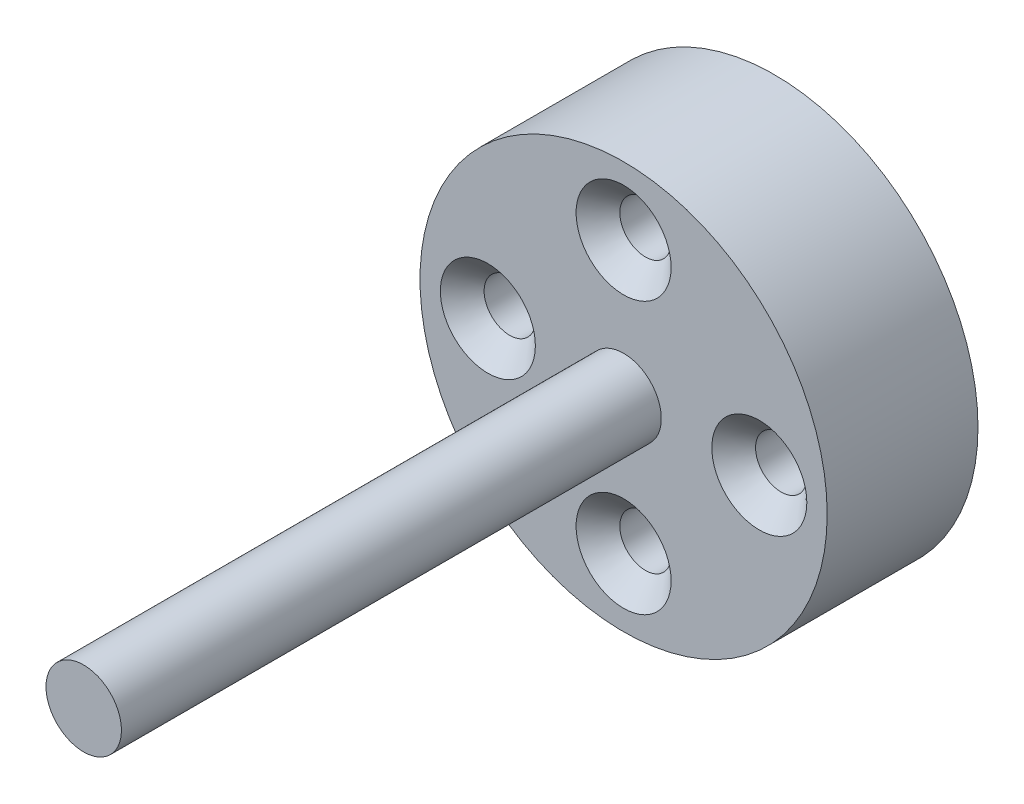
ISO-10303-21;
HEADER;
FILE_DESCRIPTION(('STEP AP214'),'2;1');
FILE_NAME('part.step','',(''),(''),'','','');
FILE_SCHEMA(('AUTOMOTIVE_DESIGN { 1 0 10303 214 1 1 1 1 }'));
ENDSEC;
DATA;
#1=APPLICATION_CONTEXT('core data for automotive mechanical design processes');
#2=APPLICATION_PROTOCOL_DEFINITION('international standard','automotive_design',2000,#1);
#3=PRODUCT_CONTEXT('',#1,'mechanical');
#4=PRODUCT('Part','Part','',(#3));
#5=PRODUCT_RELATED_PRODUCT_CATEGORY('part','',(#4));
#6=PRODUCT_DEFINITION_FORMATION('','',#4);
#7=PRODUCT_DEFINITION_CONTEXT('part definition',#1,'design');
#8=PRODUCT_DEFINITION('design','',#6,#7);
#9=PRODUCT_DEFINITION_SHAPE('','',#8);
#10=(LENGTH_UNIT() NAMED_UNIT(*) SI_UNIT(.MILLI.,.METRE.));
#11=(NAMED_UNIT(*) PLANE_ANGLE_UNIT() SI_UNIT($,.RADIAN.));
#12=(NAMED_UNIT(*) SI_UNIT($,.STERADIAN.) SOLID_ANGLE_UNIT());
#13=UNCERTAINTY_MEASURE_WITH_UNIT(LENGTH_MEASURE(1.E-05),#10,'distance_accuracy_value','');
#14=(GEOMETRIC_REPRESENTATION_CONTEXT(3) GLOBAL_UNCERTAINTY_ASSIGNED_CONTEXT((#13)) GLOBAL_UNIT_ASSIGNED_CONTEXT((#10,
#11,#12)) REPRESENTATION_CONTEXT('',''));
#15=CARTESIAN_POINT('',(0.,0.,0.));
#16=DIRECTION('',(0.,0.,1.));
#17=DIRECTION('',(1.,0.,0.));
#18=AXIS2_PLACEMENT_3D('',#15,#16,#17);
#19=CARTESIAN_POINT('',(0.,0.,0.));
#20=DIRECTION('',(0.,0.,1.));
#21=DIRECTION('',(1.,0.,0.));
#22=AXIS2_PLACEMENT_3D('',#19,#20,#21);
#23=PLANE('',#22);
#24=CARTESIAN_POINT('',(9.,0.,0.));
#25=DIRECTION('',(0.,0.,1.));
#26=DIRECTION('',(1.,0.,0.));
#27=AXIS2_PLACEMENT_3D('',#24,#25,#26);
#28=CIRCLE('',#27,1.7);
#29=CARTESIAN_POINT('',(10.7,0.,0.));
#30=VERTEX_POINT('',#29);
#31=EDGE_CURVE('E77',#30,#30,#28,.F.);
#32=ORIENTED_EDGE('',*,*,#31,.F.);
#33=EDGE_LOOP('',(#32));
#34=FACE_BOUND('',#33,.T.);
#35=CARTESIAN_POINT('',(-9.,0.,0.));
#36=DIRECTION('',(0.,0.,1.));
#37=DIRECTION('',(1.,0.,0.));
#38=AXIS2_PLACEMENT_3D('',#35,#36,#37);
#39=CIRCLE('',#38,1.7);
#40=CARTESIAN_POINT('',(-7.3,0.,0.));
#41=VERTEX_POINT('',#40);
#42=EDGE_CURVE('E68',#41,#41,#39,.F.);
#43=ORIENTED_EDGE('',*,*,#42,.F.);
#44=EDGE_LOOP('',(#43));
#45=FACE_BOUND('',#44,.T.);
#46=CARTESIAN_POINT('',(0.,0.,0.));
#47=DIRECTION('',(0.,0.,1.));
#48=DIRECTION('',(1.,0.,0.));
#49=AXIS2_PLACEMENT_3D('',#46,#47,#48);
#50=CIRCLE('',#49,13.5);
#51=CARTESIAN_POINT('',(13.5,0.,0.));
#52=VERTEX_POINT('',#51);
#53=EDGE_CURVE('E41',#52,#52,#50,.T.);
#54=ORIENTED_EDGE('',*,*,#53,.F.);
#55=EDGE_LOOP('',(#54));
#56=FACE_BOUND('',#55,.T.);
#57=CARTESIAN_POINT('',(0.,0.,0.));
#58=DIRECTION('',(0.,0.,-1.));
#59=DIRECTION('',(-1.,0.,0.));
#60=AXIS2_PLACEMENT_3D('',#57,#58,#59);
#61=CIRCLE('',#60,2.3);
#62=CARTESIAN_POINT('',(-2.3,0.,0.));
#63=VERTEX_POINT('',#62);
#64=EDGE_CURVE('E56',#63,#63,#61,.T.);
#65=ORIENTED_EDGE('',*,*,#64,.F.);
#66=EDGE_LOOP('',(#65));
#67=FACE_BOUND('',#66,.T.);
#68=CARTESIAN_POINT('',(0.,-9.,0.));
#69=DIRECTION('',(0.,0.,1.));
#70=DIRECTION('',(1.,0.,0.));
#71=AXIS2_PLACEMENT_3D('',#68,#69,#70);
#72=CIRCLE('',#71,1.7);
#73=CARTESIAN_POINT('',(1.7,-9.,0.));
#74=VERTEX_POINT('',#73);
#75=EDGE_CURVE('E59',#74,#74,#72,.F.);
#76=ORIENTED_EDGE('',*,*,#75,.F.);
#77=EDGE_LOOP('',(#76));
#78=FACE_BOUND('',#77,.T.);
#79=CARTESIAN_POINT('',(0.,9.,0.));
#80=DIRECTION('',(0.,0.,1.));
#81=DIRECTION('',(1.,0.,0.));
#82=AXIS2_PLACEMENT_3D('',#79,#80,#81);
#83=CIRCLE('',#82,1.7);
#84=CARTESIAN_POINT('',(1.7,9.,0.));
#85=VERTEX_POINT('',#84);
#86=EDGE_CURVE('E86',#85,#85,#83,.F.);
#87=ORIENTED_EDGE('',*,*,#86,.F.);
#88=EDGE_LOOP('',(#87));
#89=FACE_BOUND('',#88,.T.);
#90=ADVANCED_FACE('F37',(#34,#45,#56,#67,#78,#89),#23,.F.);
#91=CARTESIAN_POINT('',(0.,0.,10.));
#92=DIRECTION('',(0.,0.,-1.));
#93=DIRECTION('',(-1.,0.,0.));
#94=AXIS2_PLACEMENT_3D('',#91,#92,#93);
#95=CYLINDRICAL_SURFACE('',#94,13.5);
#96=CARTESIAN_POINT('',(0.,0.,10.));
#97=DIRECTION('',(0.,0.,1.));
#98=DIRECTION('',(1.,0.,0.));
#99=AXIS2_PLACEMENT_3D('',#96,#97,#98);
#100=CIRCLE('',#99,13.5);
#101=CARTESIAN_POINT('',(13.5,0.,10.));
#102=VERTEX_POINT('',#101);
#103=EDGE_CURVE('E10',#102,#102,#100,.T.);
#104=ORIENTED_EDGE('',*,*,#103,.F.);
#105=EDGE_LOOP('',(#104));
#106=FACE_BOUND('',#105,.T.);
#107=ORIENTED_EDGE('',*,*,#53,.T.);
#108=EDGE_LOOP('',(#107));
#109=FACE_BOUND('',#108,.T.);
#110=ADVANCED_FACE('F39',(#106,#109),#95,.T.);
#111=CARTESIAN_POINT('',(0.,0.,10.));
#112=DIRECTION('',(0.,0.,1.));
#113=DIRECTION('',(1.,0.,0.));
#114=AXIS2_PLACEMENT_3D('',#111,#112,#113);
#115=PLANE('',#114);
#116=CARTESIAN_POINT('',(0.,9.,10.));
#117=DIRECTION('',(0.,0.,1.));
#118=DIRECTION('',(1.,0.,0.));
#119=AXIS2_PLACEMENT_3D('',#116,#117,#118);
#120=CIRCLE('',#119,3.15);
#121=CARTESIAN_POINT('',(3.15,9.,10.));
#122=VERTEX_POINT('',#121);
#123=EDGE_CURVE('E92',#122,#122,#120,.T.);
#124=ORIENTED_EDGE('',*,*,#123,.F.);
#125=EDGE_LOOP('',(#124));
#126=FACE_BOUND('',#125,.T.);
#127=CARTESIAN_POINT('',(9.,0.,10.));
#128=DIRECTION('',(0.,0.,1.));
#129=DIRECTION('',(1.,0.,0.));
#130=AXIS2_PLACEMENT_3D('',#127,#128,#129);
#131=CIRCLE('',#130,3.15);
#132=CARTESIAN_POINT('',(12.15,0.,10.));
#133=VERTEX_POINT('',#132);
#134=EDGE_CURVE('E83',#133,#133,#131,.T.);
#135=ORIENTED_EDGE('',*,*,#134,.F.);
#136=EDGE_LOOP('',(#135));
#137=FACE_BOUND('',#136,.T.);
#138=CARTESIAN_POINT('',(-9.,0.,10.));
#139=DIRECTION('',(0.,0.,1.));
#140=DIRECTION('',(1.,0.,0.));
#141=AXIS2_PLACEMENT_3D('',#138,#139,#140);
#142=CIRCLE('',#141,3.15);
#143=CARTESIAN_POINT('',(-5.85,0.,10.));
#144=VERTEX_POINT('',#143);
#145=EDGE_CURVE('E74',#144,#144,#142,.T.);
#146=ORIENTED_EDGE('',*,*,#145,.F.);
#147=EDGE_LOOP('',(#146));
#148=FACE_BOUND('',#147,.T.);
#149=CARTESIAN_POINT('',(0.,-9.,10.));
#150=DIRECTION('',(0.,0.,1.));
#151=DIRECTION('',(1.,0.,0.));
#152=AXIS2_PLACEMENT_3D('',#149,#150,#151);
#153=CIRCLE('',#152,3.15);
#154=CARTESIAN_POINT('',(3.15,-9.,10.));
#155=VERTEX_POINT('',#154);
#156=EDGE_CURVE('E65',#155,#155,#153,.T.);
#157=ORIENTED_EDGE('',*,*,#156,.F.);
#158=EDGE_LOOP('',(#157));
#159=FACE_BOUND('',#158,.T.);
#160=CARTESIAN_POINT('',(0.,0.,10.));
#161=DIRECTION('',(0.,0.,1.));
#162=DIRECTION('',(1.,0.,0.));
#163=AXIS2_PLACEMENT_3D('',#160,#161,#162);
#164=CIRCLE('',#163,2.5);
#165=CARTESIAN_POINT('',(-2.5,0.,9.99999999999999));
#166=VERTEX_POINT('',#165);
#167=EDGE_CURVE('E50',#166,#166,#164,.T.);
#168=ORIENTED_EDGE('',*,*,#167,.F.);
#169=EDGE_LOOP('',(#168));
#170=FACE_BOUND('',#169,.T.);
#171=ORIENTED_EDGE('',*,*,#103,.T.);
#172=EDGE_LOOP('',(#171));
#173=FACE_BOUND('',#172,.T.);
#174=ADVANCED_FACE('F106',(#126,#137,#148,#159,#170,#173),#115,.T.);
#175=CARTESIAN_POINT('',(0.,0.,45.8));
#176=DIRECTION('',(0.,0.,-1.));
#177=DIRECTION('',(-1.,0.,0.));
#178=AXIS2_PLACEMENT_3D('',#175,#176,#177);
#179=CYLINDRICAL_SURFACE('',#178,2.5);
#180=CARTESIAN_POINT('',(0.,0.,45.8));
#181=DIRECTION('',(0.,0.,1.));
#182=DIRECTION('',(1.,0.,0.));
#183=AXIS2_PLACEMENT_3D('',#180,#181,#182);
#184=CIRCLE('',#183,2.5);
#185=CARTESIAN_POINT('',(-2.5,0.,45.8));
#186=VERTEX_POINT('',#185);
#187=EDGE_CURVE('E48',#186,#186,#184,.T.);
#188=CARTESIAN_POINT('',(-2.5,0.,45.8));
#189=CARTESIAN_POINT('',(-2.5,0.,45.4270833333333));
#190=CARTESIAN_POINT('',(-2.5,0.,45.0541666666667));
#191=CARTESIAN_POINT('',(-2.5,0.,44.3083333333333));
#192=CARTESIAN_POINT('',(-2.5,0.,43.9354166666667));
#193=CARTESIAN_POINT('',(-2.5,0.,43.1895833333333));
#194=CARTESIAN_POINT('',(-2.5,0.,42.8166666666667));
#195=CARTESIAN_POINT('',(-2.5,0.,42.0708333333333));
#196=CARTESIAN_POINT('',(-2.5,0.,41.6979166666667));
#197=CARTESIAN_POINT('',(-2.5,0.,40.9520833333333));
#198=CARTESIAN_POINT('',(-2.5,0.,40.5791666666667));
#199=CARTESIAN_POINT('',(-2.5,0.,39.8333333333333));
#200=CARTESIAN_POINT('',(-2.5,0.,39.4604166666667));
#201=CARTESIAN_POINT('',(-2.5,0.,38.7145833333333));
#202=CARTESIAN_POINT('',(-2.5,0.,38.3416666666667));
#203=CARTESIAN_POINT('',(-2.5,0.,37.5958333333333));
#204=CARTESIAN_POINT('',(-2.5,0.,37.2229166666667));
#205=CARTESIAN_POINT('',(-2.5,0.,36.4770833333333));
#206=CARTESIAN_POINT('',(-2.5,0.,36.1041666666667));
#207=CARTESIAN_POINT('',(-2.5,0.,35.3583333333333));
#208=CARTESIAN_POINT('',(-2.5,0.,34.9854166666667));
#209=CARTESIAN_POINT('',(-2.5,0.,34.2395833333333));
#210=CARTESIAN_POINT('',(-2.5,0.,33.8666666666667));
#211=CARTESIAN_POINT('',(-2.5,0.,33.1208333333333));
#212=CARTESIAN_POINT('',(-2.5,0.,32.7479166666667));
#213=CARTESIAN_POINT('',(-2.5,0.,32.0020833333333));
#214=CARTESIAN_POINT('',(-2.5,0.,31.6291666666667));
#215=CARTESIAN_POINT('',(-2.5,0.,30.8833333333333));
#216=CARTESIAN_POINT('',(-2.5,0.,30.5104166666667));
#217=CARTESIAN_POINT('',(-2.5,0.,29.7645833333333));
#218=CARTESIAN_POINT('',(-2.5,0.,29.3916666666667));
#219=CARTESIAN_POINT('',(-2.5,0.,28.6458333333333));
#220=CARTESIAN_POINT('',(-2.5,0.,28.2729166666667));
#221=CARTESIAN_POINT('',(-2.5,0.,27.5270833333333));
#222=CARTESIAN_POINT('',(-2.5,0.,27.1541666666667));
#223=CARTESIAN_POINT('',(-2.5,0.,26.4083333333333));
#224=CARTESIAN_POINT('',(-2.5,0.,26.0354166666667));
#225=CARTESIAN_POINT('',(-2.5,0.,25.2895833333333));
#226=CARTESIAN_POINT('',(-2.5,0.,24.9166666666667));
#227=CARTESIAN_POINT('',(-2.5,0.,24.1708333333333));
#228=CARTESIAN_POINT('',(-2.5,0.,23.7979166666667));
#229=CARTESIAN_POINT('',(-2.5,0.,23.0520833333333));
#230=CARTESIAN_POINT('',(-2.5,0.,22.6791666666667));
#231=CARTESIAN_POINT('',(-2.5,0.,21.9333333333333));
#232=CARTESIAN_POINT('',(-2.5,0.,21.5604166666667));
#233=CARTESIAN_POINT('',(-2.5,0.,20.8145833333333));
#234=CARTESIAN_POINT('',(-2.5,0.,20.4416666666667));
#235=CARTESIAN_POINT('',(-2.5,0.,19.6958333333333));
#236=CARTESIAN_POINT('',(-2.5,0.,19.3229166666667));
#237=CARTESIAN_POINT('',(-2.5,0.,18.5770833333333));
#238=CARTESIAN_POINT('',(-2.5,0.,18.2041666666667));
#239=CARTESIAN_POINT('',(-2.5,0.,17.4583333333333));
#240=CARTESIAN_POINT('',(-2.5,0.,17.0854166666667));
#241=CARTESIAN_POINT('',(-2.5,0.,16.3395833333333));
#242=CARTESIAN_POINT('',(-2.5,0.,15.9666666666667));
#243=CARTESIAN_POINT('',(-2.5,0.,15.2208333333333));
#244=CARTESIAN_POINT('',(-2.5,0.,14.8479166666667));
#245=CARTESIAN_POINT('',(-2.5,0.,14.1020833333333));
#246=CARTESIAN_POINT('',(-2.5,0.,13.7291666666667));
#247=CARTESIAN_POINT('',(-2.5,0.,12.9833333333333));
#248=CARTESIAN_POINT('',(-2.5,0.,12.6104166666667));
#249=CARTESIAN_POINT('',(-2.5,0.,11.8645833333333));
#250=CARTESIAN_POINT('',(-2.5,0.,11.4916666666667));
#251=CARTESIAN_POINT('',(-2.5,0.,10.7458333333333));
#252=CARTESIAN_POINT('',(-2.5,0.,10.3729166666667));
#253=CARTESIAN_POINT('',(-2.5,0.,9.99999999999999));
#254=B_SPLINE_CURVE_WITH_KNOTS('',3,(#188,#189,#190,#191,#192,#193,#194,#195,#196,#197,#198,
#199,#200,#201,#202,#203,#204,#205,#206,#207,#208,#209,#210,#211,#212,#213,#214,#215,#216,#217,
#218,#219,#220,#221,#222,#223,#224,#225,#226,#227,#228,#229,#230,#231,#232,#233,#234,#235,#236,
#237,#238,#239,#240,#241,#242,#243,#244,#245,#246,#247,#248,#249,#250,#251,#252,#253),
.UNSPECIFIED.,.F.,.F.,(4,2,2,2,2,2,2,2,2,2,2,2,2,2,2,2,2,2,2,2,2,2,2,2,2,2,2,2,2,2,2,2,4),(0.,
1.11874999999999,2.2375,3.35625,4.47499999999999,5.59374999999999,6.7125,7.83125,8.95,10.06875,
11.1875,12.30625,13.425,14.54375,15.6625,16.78125,17.9,19.01875,20.1375,21.25625,22.375,
23.49375,24.6125,25.73125,26.85,27.96875,29.0875,30.20625,31.325,32.44375,33.5625,34.68125,
35.8),.UNSPECIFIED.);
#255=EDGE_CURVE('BSEAM113',#186,#166,#254,.T.);
#256=ORIENTED_EDGE('',*,*,#187,.F.);
#257=ORIENTED_EDGE('',*,*,#167,.T.);
#258=ORIENTED_EDGE('',*,*,#255,.T.);
#259=ORIENTED_EDGE('',*,*,#255,.F.);
#260=EDGE_LOOP('',(#256,#258,#257,#259));
#261=FACE_BOUND('',#260,.T.);
#262=ADVANCED_FACE('F113',(#261),#179,.T.);
#263=CARTESIAN_POINT('',(0.,0.,45.8));
#264=DIRECTION('',(0.,0.,1.));
#265=DIRECTION('',(1.,0.,0.));
#266=AXIS2_PLACEMENT_3D('',#263,#264,#265);
#267=PLANE('',#266);
#268=ORIENTED_EDGE('',*,*,#187,.T.);
#269=EDGE_LOOP('',(#268));
#270=FACE_BOUND('',#269,.T.);
#271=ADVANCED_FACE('F117',(#270),#267,.T.);
#272=CARTESIAN_POINT('',(0.,0.,6.));
#273=DIRECTION('',(0.,0.,-1.));
#274=DIRECTION('',(-1.,0.,0.));
#275=AXIS2_PLACEMENT_3D('',#272,#273,#274);
#276=CYLINDRICAL_SURFACE('',#275,2.3);
#277=CARTESIAN_POINT('',(0.,0.,6.));
#278=DIRECTION('',(0.,0.,-1.));
#279=DIRECTION('',(-1.,0.,0.));
#280=AXIS2_PLACEMENT_3D('',#277,#278,#279);
#281=CIRCLE('',#280,2.3);
#282=CARTESIAN_POINT('',(-2.3,0.,6.));
#283=VERTEX_POINT('',#282);
#284=EDGE_CURVE('E53',#283,#283,#281,.T.);
#285=ORIENTED_EDGE('',*,*,#284,.F.);
#286=EDGE_LOOP('',(#285));
#287=FACE_BOUND('',#286,.T.);
#288=ORIENTED_EDGE('',*,*,#64,.T.);
#289=EDGE_LOOP('',(#288));
#290=FACE_BOUND('',#289,.T.);
#291=ADVANCED_FACE('F121',(#287,#290),#276,.F.);
#292=CARTESIAN_POINT('',(0.,0.,6.));
#293=DIRECTION('',(0.,0.,-1.));
#294=DIRECTION('',(-1.,0.,0.));
#295=AXIS2_PLACEMENT_3D('',#292,#293,#294);
#296=PLANE('',#295);
#297=ORIENTED_EDGE('',*,*,#284,.T.);
#298=EDGE_LOOP('',(#297));
#299=FACE_BOUND('',#298,.T.);
#300=ADVANCED_FACE('F125',(#299),#296,.T.);
#301=CARTESIAN_POINT('',(0.,-9.,10.));
#302=DIRECTION('',(0.,0.,1.));
#303=DIRECTION('',(1.,0.,0.));
#304=AXIS2_PLACEMENT_3D('',#301,#302,#303);
#305=CYLINDRICAL_SURFACE('',#304,1.7);
#306=ORIENTED_EDGE('',*,*,#75,.T.);
#307=EDGE_LOOP('',(#306));
#308=FACE_BOUND('',#307,.T.);
#309=CARTESIAN_POINT('',(0.,-9.,8.55));
#310=DIRECTION('',(0.,0.,1.));
#311=DIRECTION('',(1.,0.,0.));
#312=AXIS2_PLACEMENT_3D('',#309,#310,#311);
#313=CIRCLE('',#312,1.7);
#314=CARTESIAN_POINT('',(1.7,-9.,8.55));
#315=VERTEX_POINT('',#314);
#316=EDGE_CURVE('E62',#315,#315,#313,.T.);
#317=ORIENTED_EDGE('',*,*,#316,.T.);
#318=EDGE_LOOP('',(#317));
#319=FACE_BOUND('',#318,.T.);
#320=ADVANCED_FACE('F129',(#308,#319),#305,.F.);
#321=CARTESIAN_POINT('',(0.,-9.,10.));
#322=DIRECTION('',(0.,0.,1.));
#323=DIRECTION('',(1.,0.,0.));
#324=AXIS2_PLACEMENT_3D('',#321,#322,#323);
#325=CONICAL_SURFACE('',#324,3.15,0.785398163397448);
#326=ORIENTED_EDGE('',*,*,#316,.F.);
#327=EDGE_LOOP('',(#326));
#328=FACE_BOUND('',#327,.T.);
#329=ORIENTED_EDGE('',*,*,#156,.T.);
#330=EDGE_LOOP('',(#329));
#331=FACE_BOUND('',#330,.T.);
#332=ADVANCED_FACE('F133',(#328,#331),#325,.F.);
#333=CARTESIAN_POINT('',(-9.,0.,10.));
#334=DIRECTION('',(0.,0.,1.));
#335=DIRECTION('',(1.,0.,0.));
#336=AXIS2_PLACEMENT_3D('',#333,#334,#335);
#337=CYLINDRICAL_SURFACE('',#336,1.7);
#338=ORIENTED_EDGE('',*,*,#42,.T.);
#339=EDGE_LOOP('',(#338));
#340=FACE_BOUND('',#339,.T.);
#341=CARTESIAN_POINT('',(-9.,0.,8.55));
#342=DIRECTION('',(0.,0.,1.));
#343=DIRECTION('',(1.,0.,0.));
#344=AXIS2_PLACEMENT_3D('',#341,#342,#343);
#345=CIRCLE('',#344,1.7);
#346=CARTESIAN_POINT('',(-7.3,0.,8.55));
#347=VERTEX_POINT('',#346);
#348=EDGE_CURVE('E71',#347,#347,#345,.T.);
#349=ORIENTED_EDGE('',*,*,#348,.T.);
#350=EDGE_LOOP('',(#349));
#351=FACE_BOUND('',#350,.T.);
#352=ADVANCED_FACE('F137',(#340,#351),#337,.F.);
#353=CARTESIAN_POINT('',(-9.,0.,10.));
#354=DIRECTION('',(0.,0.,1.));
#355=DIRECTION('',(1.,0.,0.));
#356=AXIS2_PLACEMENT_3D('',#353,#354,#355);
#357=CONICAL_SURFACE('',#356,3.15,0.785398163397448);
#358=ORIENTED_EDGE('',*,*,#348,.F.);
#359=EDGE_LOOP('',(#358));
#360=FACE_BOUND('',#359,.T.);
#361=ORIENTED_EDGE('',*,*,#145,.T.);
#362=EDGE_LOOP('',(#361));
#363=FACE_BOUND('',#362,.T.);
#364=ADVANCED_FACE('F141',(#360,#363),#357,.F.);
#365=CARTESIAN_POINT('',(9.,0.,10.));
#366=DIRECTION('',(0.,0.,1.));
#367=DIRECTION('',(1.,0.,0.));
#368=AXIS2_PLACEMENT_3D('',#365,#366,#367);
#369=CYLINDRICAL_SURFACE('',#368,1.7);
#370=ORIENTED_EDGE('',*,*,#31,.T.);
#371=EDGE_LOOP('',(#370));
#372=FACE_BOUND('',#371,.T.);
#373=CARTESIAN_POINT('',(9.,0.,8.55));
#374=DIRECTION('',(0.,0.,1.));
#375=DIRECTION('',(1.,0.,0.));
#376=AXIS2_PLACEMENT_3D('',#373,#374,#375);
#377=CIRCLE('',#376,1.7);
#378=CARTESIAN_POINT('',(10.7,0.,8.55));
#379=VERTEX_POINT('',#378);
#380=EDGE_CURVE('E80',#379,#379,#377,.T.);
#381=ORIENTED_EDGE('',*,*,#380,.T.);
#382=EDGE_LOOP('',(#381));
#383=FACE_BOUND('',#382,.T.);
#384=ADVANCED_FACE('F145',(#372,#383),#369,.F.);
#385=CARTESIAN_POINT('',(9.,0.,10.));
#386=DIRECTION('',(0.,0.,1.));
#387=DIRECTION('',(1.,0.,0.));
#388=AXIS2_PLACEMENT_3D('',#385,#386,#387);
#389=CONICAL_SURFACE('',#388,3.15,0.785398163397448);
#390=ORIENTED_EDGE('',*,*,#380,.F.);
#391=EDGE_LOOP('',(#390));
#392=FACE_BOUND('',#391,.T.);
#393=ORIENTED_EDGE('',*,*,#134,.T.);
#394=EDGE_LOOP('',(#393));
#395=FACE_BOUND('',#394,.T.);
#396=ADVANCED_FACE('F149',(#392,#395),#389,.F.);
#397=CARTESIAN_POINT('',(0.,9.,10.));
#398=DIRECTION('',(0.,0.,1.));
#399=DIRECTION('',(1.,0.,0.));
#400=AXIS2_PLACEMENT_3D('',#397,#398,#399);
#401=CYLINDRICAL_SURFACE('',#400,1.7);
#402=ORIENTED_EDGE('',*,*,#86,.T.);
#403=EDGE_LOOP('',(#402));
#404=FACE_BOUND('',#403,.T.);
#405=CARTESIAN_POINT('',(0.,9.,8.55));
#406=DIRECTION('',(0.,0.,1.));
#407=DIRECTION('',(1.,0.,0.));
#408=AXIS2_PLACEMENT_3D('',#405,#406,#407);
#409=CIRCLE('',#408,1.7);
#410=CARTESIAN_POINT('',(1.7,9.,8.55));
#411=VERTEX_POINT('',#410);
#412=EDGE_CURVE('E89',#411,#411,#409,.T.);
#413=ORIENTED_EDGE('',*,*,#412,.T.);
#414=EDGE_LOOP('',(#413));
#415=FACE_BOUND('',#414,.T.);
#416=ADVANCED_FACE('F98',(#404,#415),#401,.F.);
#417=CARTESIAN_POINT('',(0.,9.,10.));
#418=DIRECTION('',(0.,0.,1.));
#419=DIRECTION('',(1.,0.,0.));
#420=AXIS2_PLACEMENT_3D('',#417,#418,#419);
#421=CONICAL_SURFACE('',#420,3.15,0.785398163397448);
#422=ORIENTED_EDGE('',*,*,#412,.F.);
#423=EDGE_LOOP('',(#422));
#424=FACE_BOUND('',#423,.T.);
#425=ORIENTED_EDGE('',*,*,#123,.T.);
#426=EDGE_LOOP('',(#425));
#427=FACE_BOUND('',#426,.T.);
#428=ADVANCED_FACE('F156',(#424,#427),#421,.F.);
#429=CLOSED_SHELL('',(#90,#110,#174,#262,#271,#291,#300,#320,#332,#352,#364,#384,#396,#416,#428));
#430=MANIFOLD_SOLID_BREP('B2',#429);
#431=ADVANCED_BREP_SHAPE_REPRESENTATION('',(#18,#430),#14);
#432=SHAPE_DEFINITION_REPRESENTATION(#9,#431);
ENDSEC;
END-ISO-10303-21;
